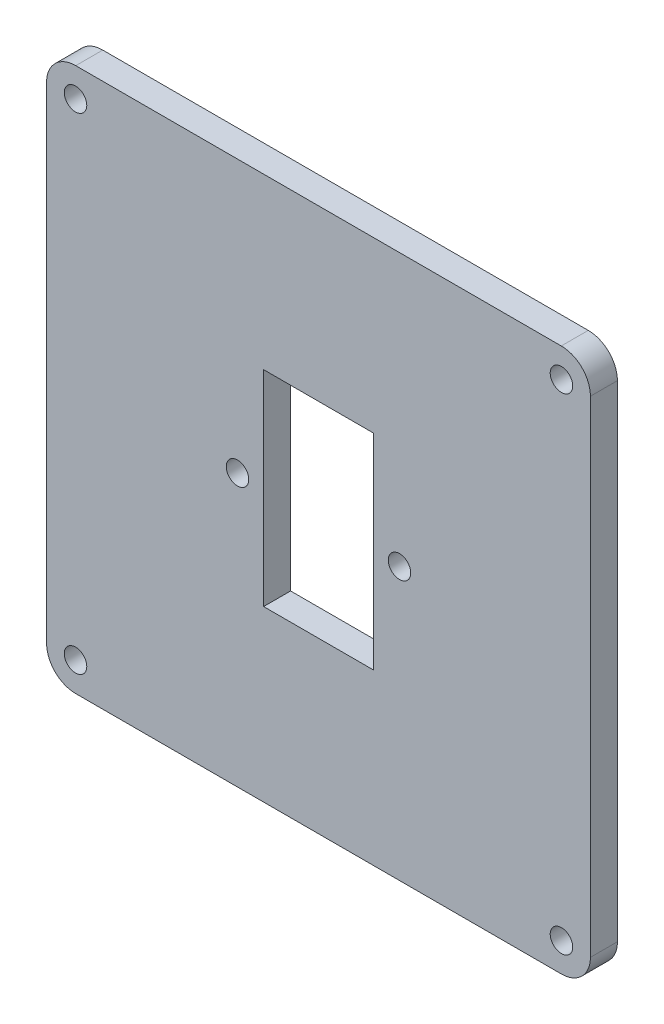
ISO-10303-21;
HEADER;
FILE_DESCRIPTION(('STEP AP214'),'2;1');
FILE_NAME('part.step','',(''),(''),'','','');
FILE_SCHEMA(('AUTOMOTIVE_DESIGN { 1 0 10303 214 1 1 1 1 }'));
ENDSEC;
DATA;
#1=APPLICATION_CONTEXT('core data for automotive mechanical design processes');
#2=APPLICATION_PROTOCOL_DEFINITION('international standard','automotive_design',2000,#1);
#3=PRODUCT_CONTEXT('',#1,'mechanical');
#4=PRODUCT('Part','Part','',(#3));
#5=PRODUCT_RELATED_PRODUCT_CATEGORY('part','',(#4));
#6=PRODUCT_DEFINITION_FORMATION('','',#4);
#7=PRODUCT_DEFINITION_CONTEXT('part definition',#1,'design');
#8=PRODUCT_DEFINITION('design','',#6,#7);
#9=PRODUCT_DEFINITION_SHAPE('','',#8);
#10=(LENGTH_UNIT() NAMED_UNIT(*) SI_UNIT(.MILLI.,.METRE.));
#11=(NAMED_UNIT(*) PLANE_ANGLE_UNIT() SI_UNIT($,.RADIAN.));
#12=(NAMED_UNIT(*) SI_UNIT($,.STERADIAN.) SOLID_ANGLE_UNIT());
#13=UNCERTAINTY_MEASURE_WITH_UNIT(LENGTH_MEASURE(1.E-05),#10,'distance_accuracy_value','');
#14=(GEOMETRIC_REPRESENTATION_CONTEXT(3) GLOBAL_UNCERTAINTY_ASSIGNED_CONTEXT((#13)) GLOBAL_UNIT_ASSIGNED_CONTEXT((#10,
#11,#12)) REPRESENTATION_CONTEXT('',''));
#15=CARTESIAN_POINT('',(0.,0.,0.));
#16=DIRECTION('',(0.,0.,1.));
#17=DIRECTION('',(1.,0.,0.));
#18=AXIS2_PLACEMENT_3D('',#15,#16,#17);
#19=CARTESIAN_POINT('',(228.017317101129,145.205782678348,3.));
#20=DIRECTION('',(0.,0.,1.));
#21=DIRECTION('',(1.,0.,0.));
#22=AXIS2_PLACEMENT_3D('',#19,#20,#21);
#23=PLANE('',#22);
#24=CARTESIAN_POINT('',(264.017321150929,118.206143662148,3.));
#25=DIRECTION('',(0.,0.,1.));
#26=DIRECTION('',(1.,0.,0.));
#27=AXIS2_PLACEMENT_3D('',#24,#25,#26);
#28=CIRCLE('',#27,1.25000000000002);
#29=CARTESIAN_POINT('',(265.267321150929,118.206143662148,3.));
#30=VERTEX_POINT('',#29);
#31=EDGE_CURVE('E327',#30,#30,#28,.T.);
#32=ORIENTED_EDGE('',*,*,#31,.F.);
#33=EDGE_LOOP('',(#32));
#34=FACE_BOUND('',#33,.T.);
#35=CARTESIAN_POINT('',(282.017317101129,145.205782678348,3.));
#36=DIRECTION('',(0.,0.,1.));
#37=DIRECTION('',(1.,0.,0.));
#38=AXIS2_PLACEMENT_3D('',#35,#36,#37);
#39=CIRCLE('',#38,1.24999999999996);
#40=CARTESIAN_POINT('',(283.267317101129,145.205782678348,3.));
#41=VERTEX_POINT('',#40);
#42=EDGE_CURVE('E339',#41,#41,#39,.T.);
#43=ORIENTED_EDGE('',*,*,#42,.F.);
#44=EDGE_LOOP('',(#43));
#45=FACE_BOUND('',#44,.T.);
#46=CARTESIAN_POINT('',(282.017317101129,91.2057826783484,3.));
#47=DIRECTION('',(0.,0.,1.));
#48=DIRECTION('',(1.,0.,0.));
#49=AXIS2_PLACEMENT_3D('',#46,#47,#48);
#50=CIRCLE('',#49,1.24999999999995);
#51=CARTESIAN_POINT('',(283.267317101129,91.2057826783484,3.));
#52=VERTEX_POINT('',#51);
#53=EDGE_CURVE('E151',#52,#52,#50,.T.);
#54=ORIENTED_EDGE('',*,*,#53,.F.);
#55=EDGE_LOOP('',(#54));
#56=FACE_BOUND('',#55,.T.);
#57=CARTESIAN_POINT('',(228.017317101129,145.205782678348,3.));
#58=DIRECTION('',(0.,0.,1.));
#59=DIRECTION('',(1.,0.,0.));
#60=AXIS2_PLACEMENT_3D('',#57,#58,#59);
#61=CIRCLE('',#60,3.21791545784593);
#62=CARTESIAN_POINT('',(228.04079572975,148.4236124824,3.));
#63=VERTEX_POINT('',#62);
#64=CARTESIAN_POINT('',(224.799401663531,145.206143662146,3.));
#65=VERTEX_POINT('',#64);
#66=EDGE_CURVE('E161',#63,#65,#61,.T.);
#67=ORIENTED_EDGE('',*,*,#66,.T.);
#68=DIRECTION('',(0.,-1.,0.));
#69=VECTOR('',#68,1.);
#70=CARTESIAN_POINT('',(224.799401663531,145.206143662146,3.));
#71=LINE('',#70,#69);
#72=CARTESIAN_POINT('',(224.799401663531,91.206143662146,3.));
#73=VERTEX_POINT('',#72);
#74=EDGE_CURVE('E164',#65,#73,#71,.T.);
#75=ORIENTED_EDGE('',*,*,#74,.T.);
#76=CARTESIAN_POINT('',(228.017317101129,91.2057826783484,3.));
#77=DIRECTION('',(0.,0.,1.));
#78=DIRECTION('',(1.,0.,0.));
#79=AXIS2_PLACEMENT_3D('',#76,#77,#78);
#80=CIRCLE('',#79,3.21791545784581);
#81=CARTESIAN_POINT('',(228.042648658479,87.9879669275564,3.));
#82=VERTEX_POINT('',#81);
#83=EDGE_CURVE('E167',#73,#82,#80,.T.);
#84=ORIENTED_EDGE('',*,*,#83,.T.);
#85=DIRECTION('',(1.,0.,0.));
#86=VECTOR('',#85,1.);
#87=CARTESIAN_POINT('',(228.042648658479,87.9879669275564,3.));
#88=LINE('',#87,#86);
#89=CARTESIAN_POINT('',(281.991993643367,87.9879669275563,3.));
#90=VERTEX_POINT('',#89);
#91=EDGE_CURVE('E169',#82,#90,#88,.T.);
#92=ORIENTED_EDGE('',*,*,#91,.T.);
#93=CARTESIAN_POINT('',(282.017317101129,91.2057826783484,3.));
#94=DIRECTION('',(0.,0.,1.));
#95=DIRECTION('',(1.,0.,0.));
#96=AXIS2_PLACEMENT_3D('',#93,#94,#95);
#97=CIRCLE('',#96,3.21791539409578);
#98=CARTESIAN_POINT('',(285.235232477242,91.2061228745628,3.));
#99=VERTEX_POINT('',#98);
#100=EDGE_CURVE('E171',#90,#99,#97,.T.);
#101=ORIENTED_EDGE('',*,*,#100,.T.);
#102=DIRECTION('',(0.,1.,0.));
#103=VECTOR('',#102,1.);
#104=CARTESIAN_POINT('',(285.235232477242,91.2061228745628,3.));
#105=LINE('',#104,#103);
#106=CARTESIAN_POINT('',(285.235232477242,145.20616444973,3.));
#107=VERTEX_POINT('',#106);
#108=EDGE_CURVE('E173',#99,#107,#105,.T.);
#109=ORIENTED_EDGE('',*,*,#108,.T.);
#110=CARTESIAN_POINT('',(282.017317101129,145.205782678348,3.));
#111=DIRECTION('',(0.,0.,1.));
#112=DIRECTION('',(1.,0.,0.));
#113=AXIS2_PLACEMENT_3D('',#110,#111,#112);
#114=CIRCLE('',#113,3.21791539875964);
#115=CARTESIAN_POINT('',(281.993846572094,148.4236124824,3.));
#116=VERTEX_POINT('',#115);
#117=EDGE_CURVE('E175',#107,#116,#114,.T.);
#118=ORIENTED_EDGE('',*,*,#117,.T.);
#119=DIRECTION('',(-1.,0.,0.));
#120=VECTOR('',#119,1.);
#121=CARTESIAN_POINT('',(228.04079572975,148.4236124824,3.));
#122=LINE('',#121,#120);
#123=EDGE_CURVE('E177',#116,#63,#122,.T.);
#124=ORIENTED_EDGE('',*,*,#123,.T.);
#125=EDGE_LOOP('',(#67,#75,#84,#92,#101,#109,#118,#124));
#126=FACE_BOUND('',#125,.T.);
#127=DIRECTION('',(1.,0.,0.));
#128=VECTOR('',#127,1.);
#129=CARTESIAN_POINT('',(248.917321150929,106.806143662148,3.));
#130=LINE('',#129,#128);
#131=CARTESIAN_POINT('',(248.917321150929,106.806143662148,3.));
#132=VERTEX_POINT('',#131);
#133=CARTESIAN_POINT('',(261.117321150929,106.806143662148,3.));
#134=VERTEX_POINT('',#133);
#135=EDGE_CURVE('E130',#132,#134,#130,.T.);
#136=ORIENTED_EDGE('',*,*,#135,.F.);
#137=DIRECTION('',(0.,-1.,0.));
#138=VECTOR('',#137,1.);
#139=CARTESIAN_POINT('',(248.917321150929,129.606143662148,3.));
#140=LINE('',#139,#138);
#141=CARTESIAN_POINT('',(248.917321150929,129.606143662148,3.));
#142=VERTEX_POINT('',#141);
#143=EDGE_CURVE('E122',#142,#132,#140,.T.);
#144=ORIENTED_EDGE('',*,*,#143,.F.);
#145=DIRECTION('',(-1.,0.,0.));
#146=VECTOR('',#145,1.);
#147=CARTESIAN_POINT('',(261.117321150929,129.606143662148,3.));
#148=LINE('',#147,#146);
#149=CARTESIAN_POINT('',(261.117321150929,129.606143662148,3.));
#150=VERTEX_POINT('',#149);
#151=EDGE_CURVE('E145',#150,#142,#148,.T.);
#152=ORIENTED_EDGE('',*,*,#151,.F.);
#153=DIRECTION('',(0.,1.,0.));
#154=VECTOR('',#153,1.);
#155=CARTESIAN_POINT('',(261.117321150929,106.806143662148,3.));
#156=LINE('',#155,#154);
#157=EDGE_CURVE('E143',#134,#150,#156,.T.);
#158=ORIENTED_EDGE('',*,*,#157,.F.);
#159=EDGE_LOOP('',(#136,#144,#152,#158));
#160=FACE_BOUND('',#159,.T.);
#161=CARTESIAN_POINT('',(228.017317101129,91.2057826783484,3.));
#162=DIRECTION('',(0.,0.,1.));
#163=DIRECTION('',(1.,0.,0.));
#164=AXIS2_PLACEMENT_3D('',#161,#162,#163);
#165=CIRCLE('',#164,1.25000000000001);
#166=CARTESIAN_POINT('',(229.267317101129,91.2057826783484,3.));
#167=VERTEX_POINT('',#166);
#168=EDGE_CURVE('E345',#167,#167,#165,.T.);
#169=ORIENTED_EDGE('',*,*,#168,.F.);
#170=EDGE_LOOP('',(#169));
#171=FACE_BOUND('',#170,.T.);
#172=CARTESIAN_POINT('',(246.017321150929,118.206143662148,3.));
#173=DIRECTION('',(0.,0.,1.));
#174=DIRECTION('',(1.,0.,0.));
#175=AXIS2_PLACEMENT_3D('',#172,#173,#174);
#176=CIRCLE('',#175,1.25000000000001);
#177=CARTESIAN_POINT('',(247.267321150929,118.206143662148,3.));
#178=VERTEX_POINT('',#177);
#179=EDGE_CURVE('E333',#178,#178,#176,.T.);
#180=ORIENTED_EDGE('',*,*,#179,.F.);
#181=EDGE_LOOP('',(#180));
#182=FACE_BOUND('',#181,.T.);
#183=CARTESIAN_POINT('',(228.017317101129,145.205782678348,3.));
#184=DIRECTION('',(0.,0.,1.));
#185=DIRECTION('',(1.,0.,0.));
#186=AXIS2_PLACEMENT_3D('',#183,#184,#185);
#187=CIRCLE('',#186,1.25000000000001);
#188=CARTESIAN_POINT('',(229.267317101129,145.205782678348,3.));
#189=VERTEX_POINT('',#188);
#190=EDGE_CURVE('E318',#189,#189,#187,.T.);
#191=ORIENTED_EDGE('',*,*,#190,.F.);
#192=EDGE_LOOP('',(#191));
#193=FACE_BOUND('',#192,.T.);
#194=ADVANCED_FACE('F33',(#34,#45,#56,#126,#160,#171,#182,#193),#23,.T.);
#195=CARTESIAN_POINT('',(228.017317101129,145.205782678348,0.));
#196=DIRECTION('',(0.,0.,1.));
#197=DIRECTION('',(1.,0.,0.));
#198=AXIS2_PLACEMENT_3D('',#195,#196,#197);
#199=PLANE('',#198);
#200=CARTESIAN_POINT('',(228.017317101129,145.205782678348,0.));
#201=DIRECTION('',(0.,0.,1.));
#202=DIRECTION('',(1.,0.,0.));
#203=AXIS2_PLACEMENT_3D('',#200,#201,#202);
#204=CIRCLE('',#203,3.21791545784593);
#205=CARTESIAN_POINT('',(228.04079572975,148.4236124824,0.));
#206=VERTEX_POINT('',#205);
#207=CARTESIAN_POINT('',(224.799401663531,145.206143662146,0.));
#208=VERTEX_POINT('',#207);
#209=EDGE_CURVE('E138',#206,#208,#204,.T.);
#210=ORIENTED_EDGE('',*,*,#209,.F.);
#211=DIRECTION('',(-1.,0.,0.));
#212=VECTOR('',#211,1.);
#213=CARTESIAN_POINT('',(228.04079572975,148.4236124824,0.));
#214=LINE('',#213,#212);
#215=CARTESIAN_POINT('',(281.993846572094,148.4236124824,0.));
#216=VERTEX_POINT('',#215);
#217=EDGE_CURVE('E165',#216,#206,#214,.T.);
#218=ORIENTED_EDGE('',*,*,#217,.F.);
#219=CARTESIAN_POINT('',(282.017317101129,145.205782678348,0.));
#220=DIRECTION('',(0.,0.,1.));
#221=DIRECTION('',(1.,0.,0.));
#222=AXIS2_PLACEMENT_3D('',#219,#220,#221);
#223=CIRCLE('',#222,3.21791539875964);
#224=CARTESIAN_POINT('',(285.235232477242,145.20616444973,0.));
#225=VERTEX_POINT('',#224);
#226=EDGE_CURVE('E192',#225,#216,#223,.T.);
#227=ORIENTED_EDGE('',*,*,#226,.F.);
#228=DIRECTION('',(0.,1.,0.));
#229=VECTOR('',#228,1.);
#230=CARTESIAN_POINT('',(285.235232477242,91.2061228745628,0.));
#231=LINE('',#230,#229);
#232=CARTESIAN_POINT('',(285.235232477242,91.2061228745628,0.));
#233=VERTEX_POINT('',#232);
#234=EDGE_CURVE('E190',#233,#225,#231,.T.);
#235=ORIENTED_EDGE('',*,*,#234,.F.);
#236=CARTESIAN_POINT('',(282.017317101129,91.2057826783484,0.));
#237=DIRECTION('',(0.,0.,1.));
#238=DIRECTION('',(1.,0.,0.));
#239=AXIS2_PLACEMENT_3D('',#236,#237,#238);
#240=CIRCLE('',#239,3.21791539409578);
#241=CARTESIAN_POINT('',(281.991993643367,87.9879669275563,0.));
#242=VERTEX_POINT('',#241);
#243=EDGE_CURVE('E188',#242,#233,#240,.T.);
#244=ORIENTED_EDGE('',*,*,#243,.F.);
#245=DIRECTION('',(1.,0.,0.));
#246=VECTOR('',#245,1.);
#247=CARTESIAN_POINT('',(228.042648658479,87.9879669275564,0.));
#248=LINE('',#247,#246);
#249=CARTESIAN_POINT('',(228.042648658479,87.9879669275564,0.));
#250=VERTEX_POINT('',#249);
#251=EDGE_CURVE('E186',#250,#242,#248,.T.);
#252=ORIENTED_EDGE('',*,*,#251,.F.);
#253=CARTESIAN_POINT('',(228.017317101129,91.2057826783484,0.));
#254=DIRECTION('',(0.,0.,1.));
#255=DIRECTION('',(1.,0.,0.));
#256=AXIS2_PLACEMENT_3D('',#253,#254,#255);
#257=CIRCLE('',#256,3.21791545784581);
#258=CARTESIAN_POINT('',(224.799401663531,91.206143662146,0.));
#259=VERTEX_POINT('',#258);
#260=EDGE_CURVE('E184',#259,#250,#257,.T.);
#261=ORIENTED_EDGE('',*,*,#260,.F.);
#262=DIRECTION('',(0.,-1.,0.));
#263=VECTOR('',#262,1.);
#264=CARTESIAN_POINT('',(224.799401663531,145.206143662146,0.));
#265=LINE('',#264,#263);
#266=EDGE_CURVE('E182',#208,#259,#265,.T.);
#267=ORIENTED_EDGE('',*,*,#266,.F.);
#268=EDGE_LOOP('',(#210,#218,#227,#235,#244,#252,#261,#267));
#269=FACE_BOUND('',#268,.T.);
#270=DIRECTION('',(0.,-1.,0.));
#271=VECTOR('',#270,1.);
#272=CARTESIAN_POINT('',(248.917321150929,129.606143662148,0.));
#273=LINE('',#272,#271);
#274=CARTESIAN_POINT('',(248.917321150929,129.606143662148,0.));
#275=VERTEX_POINT('',#274);
#276=CARTESIAN_POINT('',(248.917321150929,106.806143662148,0.));
#277=VERTEX_POINT('',#276);
#278=EDGE_CURVE('E56',#275,#277,#273,.T.);
#279=ORIENTED_EDGE('',*,*,#278,.T.);
#280=DIRECTION('',(1.,0.,0.));
#281=VECTOR('',#280,1.);
#282=CARTESIAN_POINT('',(248.917321150929,106.806143662148,0.));
#283=LINE('',#282,#281);
#284=CARTESIAN_POINT('',(261.117321150929,106.806143662148,0.));
#285=VERTEX_POINT('',#284);
#286=EDGE_CURVE('E137',#277,#285,#283,.T.);
#287=ORIENTED_EDGE('',*,*,#286,.T.);
#288=DIRECTION('',(0.,1.,0.));
#289=VECTOR('',#288,1.);
#290=CARTESIAN_POINT('',(261.117321150929,106.806143662148,0.));
#291=LINE('',#290,#289);
#292=CARTESIAN_POINT('',(261.117321150929,129.606143662148,0.));
#293=VERTEX_POINT('',#292);
#294=EDGE_CURVE('E153',#285,#293,#291,.T.);
#295=ORIENTED_EDGE('',*,*,#294,.T.);
#296=DIRECTION('',(-1.,0.,0.));
#297=VECTOR('',#296,1.);
#298=CARTESIAN_POINT('',(261.117321150929,129.606143662148,0.));
#299=LINE('',#298,#297);
#300=EDGE_CURVE('E131',#293,#275,#299,.T.);
#301=ORIENTED_EDGE('',*,*,#300,.T.);
#302=EDGE_LOOP('',(#279,#287,#295,#301));
#303=FACE_BOUND('',#302,.T.);
#304=CARTESIAN_POINT('',(282.017317101129,91.2057826783484,0.));
#305=DIRECTION('',(0.,0.,1.));
#306=DIRECTION('',(1.,0.,0.));
#307=AXIS2_PLACEMENT_3D('',#304,#305,#306);
#308=CIRCLE('',#307,1.24999999999995);
#309=CARTESIAN_POINT('',(283.267317101129,91.2057826783484,0.));
#310=VERTEX_POINT('',#309);
#311=EDGE_CURVE('E348',#310,#310,#308,.T.);
#312=ORIENTED_EDGE('',*,*,#311,.T.);
#313=EDGE_LOOP('',(#312));
#314=FACE_BOUND('',#313,.T.);
#315=CARTESIAN_POINT('',(228.017317101129,91.2057826783484,0.));
#316=DIRECTION('',(0.,0.,1.));
#317=DIRECTION('',(1.,0.,0.));
#318=AXIS2_PLACEMENT_3D('',#315,#316,#317);
#319=CIRCLE('',#318,1.25000000000001);
#320=CARTESIAN_POINT('',(229.267317101129,91.2057826783484,0.));
#321=VERTEX_POINT('',#320);
#322=EDGE_CURVE('E342',#321,#321,#319,.T.);
#323=ORIENTED_EDGE('',*,*,#322,.T.);
#324=EDGE_LOOP('',(#323));
#325=FACE_BOUND('',#324,.T.);
#326=CARTESIAN_POINT('',(282.017317101129,145.205782678348,0.));
#327=DIRECTION('',(0.,0.,1.));
#328=DIRECTION('',(1.,0.,0.));
#329=AXIS2_PLACEMENT_3D('',#326,#327,#328);
#330=CIRCLE('',#329,1.24999999999996);
#331=CARTESIAN_POINT('',(283.267317101129,145.205782678348,0.));
#332=VERTEX_POINT('',#331);
#333=EDGE_CURVE('E336',#332,#332,#330,.T.);
#334=ORIENTED_EDGE('',*,*,#333,.T.);
#335=EDGE_LOOP('',(#334));
#336=FACE_BOUND('',#335,.T.);
#337=CARTESIAN_POINT('',(246.017321150929,118.206143662148,0.));
#338=DIRECTION('',(0.,0.,1.));
#339=DIRECTION('',(1.,0.,0.));
#340=AXIS2_PLACEMENT_3D('',#337,#338,#339);
#341=CIRCLE('',#340,1.25000000000001);
#342=CARTESIAN_POINT('',(247.267321150929,118.206143662148,0.));
#343=VERTEX_POINT('',#342);
#344=EDGE_CURVE('E330',#343,#343,#341,.T.);
#345=ORIENTED_EDGE('',*,*,#344,.T.);
#346=EDGE_LOOP('',(#345));
#347=FACE_BOUND('',#346,.T.);
#348=CARTESIAN_POINT('',(264.017321150929,118.206143662148,0.));
#349=DIRECTION('',(0.,0.,1.));
#350=DIRECTION('',(1.,0.,0.));
#351=AXIS2_PLACEMENT_3D('',#348,#349,#350);
#352=CIRCLE('',#351,1.25000000000002);
#353=CARTESIAN_POINT('',(265.267321150929,118.206143662148,0.));
#354=VERTEX_POINT('',#353);
#355=EDGE_CURVE('E324',#354,#354,#352,.T.);
#356=ORIENTED_EDGE('',*,*,#355,.T.);
#357=EDGE_LOOP('',(#356));
#358=FACE_BOUND('',#357,.T.);
#359=CARTESIAN_POINT('',(228.017317101129,145.205782678348,0.));
#360=DIRECTION('',(0.,0.,1.));
#361=DIRECTION('',(1.,0.,0.));
#362=AXIS2_PLACEMENT_3D('',#359,#360,#361);
#363=CIRCLE('',#362,1.25000000000001);
#364=CARTESIAN_POINT('',(229.267317101129,145.205782678348,0.));
#365=VERTEX_POINT('',#364);
#366=EDGE_CURVE('E321',#365,#365,#363,.T.);
#367=ORIENTED_EDGE('',*,*,#366,.T.);
#368=EDGE_LOOP('',(#367));
#369=FACE_BOUND('',#368,.T.);
#370=ADVANCED_FACE('F222',(#269,#303,#314,#325,#336,#347,#358,#369),#199,.F.);
#371=CARTESIAN_POINT('',(228.017317101129,145.205782678348,3.));
#372=DIRECTION('',(0.,0.,-1.));
#373=DIRECTION('',(-1.,0.,0.));
#374=AXIS2_PLACEMENT_3D('',#371,#372,#373);
#375=CYLINDRICAL_SURFACE('',#374,3.21791545784593);
#376=ORIENTED_EDGE('',*,*,#209,.T.);
#377=DIRECTION('',(0.,0.,-1.));
#378=VECTOR('',#377,1.);
#379=CARTESIAN_POINT('',(224.799401663531,145.206143662146,3.));
#380=LINE('',#379,#378);
#381=EDGE_CURVE('E11',#65,#208,#380,.T.);
#382=ORIENTED_EDGE('',*,*,#381,.F.);
#383=ORIENTED_EDGE('',*,*,#66,.F.);
#384=DIRECTION('',(0.,0.,-1.));
#385=VECTOR('',#384,1.);
#386=CARTESIAN_POINT('',(228.04079572975,148.4236124824,3.));
#387=LINE('',#386,#385);
#388=EDGE_CURVE('E179',#63,#206,#387,.T.);
#389=ORIENTED_EDGE('',*,*,#388,.T.);
#390=EDGE_LOOP('',(#376,#382,#383,#389));
#391=FACE_BOUND('',#390,.T.);
#392=ADVANCED_FACE('F35',(#391),#375,.T.);
#393=CARTESIAN_POINT('',(224.799401663531,145.206143662146,3.));
#394=DIRECTION('',(1.,0.,0.));
#395=DIRECTION('',(0.,1.,0.));
#396=AXIS2_PLACEMENT_3D('',#393,#394,#395);
#397=PLANE('',#396);
#398=ORIENTED_EDGE('',*,*,#266,.T.);
#399=DIRECTION('',(0.,0.,-1.));
#400=VECTOR('',#399,1.);
#401=CARTESIAN_POINT('',(224.799401663531,91.206143662146,3.));
#402=LINE('',#401,#400);
#403=EDGE_CURVE('E41',#73,#259,#402,.T.);
#404=ORIENTED_EDGE('',*,*,#403,.F.);
#405=ORIENTED_EDGE('',*,*,#74,.F.);
#406=ORIENTED_EDGE('',*,*,#381,.T.);
#407=EDGE_LOOP('',(#398,#404,#405,#406));
#408=FACE_BOUND('',#407,.T.);
#409=ADVANCED_FACE('F239',(#408),#397,.F.);
#410=CARTESIAN_POINT('',(228.017317101129,91.2057826783484,3.));
#411=DIRECTION('',(0.,0.,-1.));
#412=DIRECTION('',(-1.,0.,0.));
#413=AXIS2_PLACEMENT_3D('',#410,#411,#412);
#414=CYLINDRICAL_SURFACE('',#413,3.21791545784581);
#415=ORIENTED_EDGE('',*,*,#260,.T.);
#416=DIRECTION('',(0.,0.,-1.));
#417=VECTOR('',#416,1.);
#418=CARTESIAN_POINT('',(228.042648658479,87.9879669275564,3.));
#419=LINE('',#418,#417);
#420=EDGE_CURVE('E209',#82,#250,#419,.T.);
#421=ORIENTED_EDGE('',*,*,#420,.F.);
#422=ORIENTED_EDGE('',*,*,#83,.F.);
#423=ORIENTED_EDGE('',*,*,#403,.T.);
#424=EDGE_LOOP('',(#415,#421,#422,#423));
#425=FACE_BOUND('',#424,.T.);
#426=ADVANCED_FACE('F216',(#425),#414,.T.);
#427=CARTESIAN_POINT('',(228.042648658479,87.9879669275564,3.));
#428=DIRECTION('',(0.,1.,0.));
#429=DIRECTION('',(-1.,0.,0.));
#430=AXIS2_PLACEMENT_3D('',#427,#428,#429);
#431=PLANE('',#430);
#432=ORIENTED_EDGE('',*,*,#251,.T.);
#433=DIRECTION('',(0.,0.,-1.));
#434=VECTOR('',#433,1.);
#435=CARTESIAN_POINT('',(281.991993643367,87.9879669275563,3.));
#436=LINE('',#435,#434);
#437=EDGE_CURVE('E206',#90,#242,#436,.T.);
#438=ORIENTED_EDGE('',*,*,#437,.F.);
#439=ORIENTED_EDGE('',*,*,#91,.F.);
#440=ORIENTED_EDGE('',*,*,#420,.T.);
#441=EDGE_LOOP('',(#432,#438,#439,#440));
#442=FACE_BOUND('',#441,.T.);
#443=ADVANCED_FACE('F228',(#442),#431,.F.);
#444=CARTESIAN_POINT('',(282.017317101129,91.2057826783484,3.));
#445=DIRECTION('',(0.,0.,-1.));
#446=DIRECTION('',(-1.,0.,0.));
#447=AXIS2_PLACEMENT_3D('',#444,#445,#446);
#448=CYLINDRICAL_SURFACE('',#447,3.21791539409578);
#449=ORIENTED_EDGE('',*,*,#243,.T.);
#450=DIRECTION('',(0.,0.,-1.));
#451=VECTOR('',#450,1.);
#452=CARTESIAN_POINT('',(285.235232477242,91.2061228745628,3.));
#453=LINE('',#452,#451);
#454=EDGE_CURVE('E203',#99,#233,#453,.T.);
#455=ORIENTED_EDGE('',*,*,#454,.F.);
#456=ORIENTED_EDGE('',*,*,#100,.F.);
#457=ORIENTED_EDGE('',*,*,#437,.T.);
#458=EDGE_LOOP('',(#449,#455,#456,#457));
#459=FACE_BOUND('',#458,.T.);
#460=ADVANCED_FACE('F232',(#459),#448,.T.);
#461=CARTESIAN_POINT('',(285.235232477242,91.2061228745628,3.));
#462=DIRECTION('',(-1.,0.,0.));
#463=DIRECTION('',(0.,0.,1.));
#464=AXIS2_PLACEMENT_3D('',#461,#462,#463);
#465=PLANE('',#464);
#466=ORIENTED_EDGE('',*,*,#234,.T.);
#467=DIRECTION('',(0.,0.,-1.));
#468=VECTOR('',#467,1.);
#469=CARTESIAN_POINT('',(285.235232477242,145.20616444973,3.));
#470=LINE('',#469,#468);
#471=EDGE_CURVE('E200',#107,#225,#470,.T.);
#472=ORIENTED_EDGE('',*,*,#471,.F.);
#473=ORIENTED_EDGE('',*,*,#108,.F.);
#474=ORIENTED_EDGE('',*,*,#454,.T.);
#475=EDGE_LOOP('',(#466,#472,#473,#474));
#476=FACE_BOUND('',#475,.T.);
#477=ADVANCED_FACE('F252',(#476),#465,.F.);
#478=CARTESIAN_POINT('',(282.017317101129,145.205782678348,3.));
#479=DIRECTION('',(0.,0.,-1.));
#480=DIRECTION('',(-1.,0.,0.));
#481=AXIS2_PLACEMENT_3D('',#478,#479,#480);
#482=CYLINDRICAL_SURFACE('',#481,3.21791539875964);
#483=ORIENTED_EDGE('',*,*,#226,.T.);
#484=DIRECTION('',(0.,0.,-1.));
#485=VECTOR('',#484,1.);
#486=CARTESIAN_POINT('',(281.993846572094,148.4236124824,3.));
#487=LINE('',#486,#485);
#488=EDGE_CURVE('E197',#116,#216,#487,.T.);
#489=ORIENTED_EDGE('',*,*,#488,.F.);
#490=ORIENTED_EDGE('',*,*,#117,.F.);
#491=ORIENTED_EDGE('',*,*,#471,.T.);
#492=EDGE_LOOP('',(#483,#489,#490,#491));
#493=FACE_BOUND('',#492,.T.);
#494=ADVANCED_FACE('F250',(#493),#482,.T.);
#495=CARTESIAN_POINT('',(228.04079572975,148.4236124824,3.));
#496=DIRECTION('',(0.,-1.,0.));
#497=DIRECTION('',(1.,0.,0.));
#498=AXIS2_PLACEMENT_3D('',#495,#496,#497);
#499=PLANE('',#498);
#500=ORIENTED_EDGE('',*,*,#217,.T.);
#501=ORIENTED_EDGE('',*,*,#388,.F.);
#502=ORIENTED_EDGE('',*,*,#123,.F.);
#503=ORIENTED_EDGE('',*,*,#488,.T.);
#504=EDGE_LOOP('',(#500,#501,#502,#503));
#505=FACE_BOUND('',#504,.T.);
#506=ADVANCED_FACE('F245',(#505),#499,.F.);
#507=CARTESIAN_POINT('',(248.917321150929,129.606143662148,3.));
#508=DIRECTION('',(1.,0.,0.));
#509=DIRECTION('',(0.,0.,-1.));
#510=AXIS2_PLACEMENT_3D('',#507,#508,#509);
#511=PLANE('',#510);
#512=ORIENTED_EDGE('',*,*,#278,.F.);
#513=DIRECTION('',(0.,0.,-1.));
#514=VECTOR('',#513,1.);
#515=CARTESIAN_POINT('',(248.917321150929,129.606143662148,3.));
#516=LINE('',#515,#514);
#517=EDGE_CURVE('E126',#142,#275,#516,.T.);
#518=ORIENTED_EDGE('',*,*,#517,.F.);
#519=ORIENTED_EDGE('',*,*,#143,.T.);
#520=DIRECTION('',(0.,0.,-1.));
#521=VECTOR('',#520,1.);
#522=CARTESIAN_POINT('',(248.917321150929,106.806143662148,3.));
#523=LINE('',#522,#521);
#524=EDGE_CURVE('E125',#132,#277,#523,.T.);
#525=ORIENTED_EDGE('',*,*,#524,.T.);
#526=EDGE_LOOP('',(#512,#518,#519,#525));
#527=FACE_BOUND('',#526,.T.);
#528=ADVANCED_FACE('F124',(#527),#511,.T.);
#529=CARTESIAN_POINT('',(248.917321150929,106.806143662148,3.));
#530=DIRECTION('',(0.,1.,0.));
#531=DIRECTION('',(0.,0.,1.));
#532=AXIS2_PLACEMENT_3D('',#529,#530,#531);
#533=PLANE('',#532);
#534=ORIENTED_EDGE('',*,*,#286,.F.);
#535=ORIENTED_EDGE('',*,*,#524,.F.);
#536=ORIENTED_EDGE('',*,*,#135,.T.);
#537=DIRECTION('',(0.,0.,-1.));
#538=VECTOR('',#537,1.);
#539=CARTESIAN_POINT('',(261.117321150929,106.806143662148,3.));
#540=LINE('',#539,#538);
#541=EDGE_CURVE('E139',#134,#285,#540,.T.);
#542=ORIENTED_EDGE('',*,*,#541,.T.);
#543=EDGE_LOOP('',(#534,#535,#536,#542));
#544=FACE_BOUND('',#543,.T.);
#545=ADVANCED_FACE('F134',(#544),#533,.T.);
#546=CARTESIAN_POINT('',(261.117321150929,106.806143662148,3.));
#547=DIRECTION('',(-1.,0.,0.));
#548=DIRECTION('',(0.,0.,1.));
#549=AXIS2_PLACEMENT_3D('',#546,#547,#548);
#550=PLANE('',#549);
#551=ORIENTED_EDGE('',*,*,#294,.F.);
#552=ORIENTED_EDGE('',*,*,#541,.F.);
#553=ORIENTED_EDGE('',*,*,#157,.T.);
#554=DIRECTION('',(0.,0.,-1.));
#555=VECTOR('',#554,1.);
#556=CARTESIAN_POINT('',(261.117321150929,129.606143662148,3.));
#557=LINE('',#556,#555);
#558=EDGE_CURVE('E48',#150,#293,#557,.T.);
#559=ORIENTED_EDGE('',*,*,#558,.T.);
#560=EDGE_LOOP('',(#551,#552,#553,#559));
#561=FACE_BOUND('',#560,.T.);
#562=ADVANCED_FACE('F280',(#561),#550,.T.);
#563=CARTESIAN_POINT('',(261.117321150929,129.606143662148,3.));
#564=DIRECTION('',(0.,-1.,0.));
#565=DIRECTION('',(0.,0.,-1.));
#566=AXIS2_PLACEMENT_3D('',#563,#564,#565);
#567=PLANE('',#566);
#568=ORIENTED_EDGE('',*,*,#300,.F.);
#569=ORIENTED_EDGE('',*,*,#558,.F.);
#570=ORIENTED_EDGE('',*,*,#151,.T.);
#571=ORIENTED_EDGE('',*,*,#517,.T.);
#572=EDGE_LOOP('',(#568,#569,#570,#571));
#573=FACE_BOUND('',#572,.T.);
#574=ADVANCED_FACE('F284',(#573),#567,.T.);
#575=CARTESIAN_POINT('',(282.017317101129,91.2057826783484,3.));
#576=DIRECTION('',(0.,0.,-1.));
#577=DIRECTION('',(-1.,0.,0.));
#578=AXIS2_PLACEMENT_3D('',#575,#576,#577);
#579=CYLINDRICAL_SURFACE('',#578,1.24999999999995);
#580=ORIENTED_EDGE('',*,*,#53,.T.);
#581=EDGE_LOOP('',(#580));
#582=FACE_BOUND('',#581,.T.);
#583=ORIENTED_EDGE('',*,*,#311,.F.);
#584=EDGE_LOOP('',(#583));
#585=FACE_BOUND('',#584,.T.);
#586=ADVANCED_FACE('F290',(#582,#585),#579,.F.);
#587=CARTESIAN_POINT('',(228.017317101129,91.2057826783484,3.));
#588=DIRECTION('',(0.,0.,-1.));
#589=DIRECTION('',(-1.,0.,0.));
#590=AXIS2_PLACEMENT_3D('',#587,#588,#589);
#591=CYLINDRICAL_SURFACE('',#590,1.25000000000001);
#592=ORIENTED_EDGE('',*,*,#168,.T.);
#593=EDGE_LOOP('',(#592));
#594=FACE_BOUND('',#593,.T.);
#595=ORIENTED_EDGE('',*,*,#322,.F.);
#596=EDGE_LOOP('',(#595));
#597=FACE_BOUND('',#596,.T.);
#598=ADVANCED_FACE('F293',(#594,#597),#591,.F.);
#599=CARTESIAN_POINT('',(282.017317101129,145.205782678348,3.));
#600=DIRECTION('',(0.,0.,-1.));
#601=DIRECTION('',(-1.,0.,0.));
#602=AXIS2_PLACEMENT_3D('',#599,#600,#601);
#603=CYLINDRICAL_SURFACE('',#602,1.24999999999996);
#604=ORIENTED_EDGE('',*,*,#42,.T.);
#605=EDGE_LOOP('',(#604));
#606=FACE_BOUND('',#605,.T.);
#607=ORIENTED_EDGE('',*,*,#333,.F.);
#608=EDGE_LOOP('',(#607));
#609=FACE_BOUND('',#608,.T.);
#610=ADVANCED_FACE('F297',(#606,#609),#603,.F.);
#611=CARTESIAN_POINT('',(246.017321150929,118.206143662148,3.));
#612=DIRECTION('',(0.,0.,-1.));
#613=DIRECTION('',(-1.,0.,0.));
#614=AXIS2_PLACEMENT_3D('',#611,#612,#613);
#615=CYLINDRICAL_SURFACE('',#614,1.25000000000001);
#616=ORIENTED_EDGE('',*,*,#179,.T.);
#617=EDGE_LOOP('',(#616));
#618=FACE_BOUND('',#617,.T.);
#619=ORIENTED_EDGE('',*,*,#344,.F.);
#620=EDGE_LOOP('',(#619));
#621=FACE_BOUND('',#620,.T.);
#622=ADVANCED_FACE('F301',(#618,#621),#615,.F.);
#623=CARTESIAN_POINT('',(264.017321150929,118.206143662148,3.));
#624=DIRECTION('',(0.,0.,-1.));
#625=DIRECTION('',(-1.,0.,0.));
#626=AXIS2_PLACEMENT_3D('',#623,#624,#625);
#627=CYLINDRICAL_SURFACE('',#626,1.25000000000002);
#628=ORIENTED_EDGE('',*,*,#31,.T.);
#629=EDGE_LOOP('',(#628));
#630=FACE_BOUND('',#629,.T.);
#631=ORIENTED_EDGE('',*,*,#355,.F.);
#632=EDGE_LOOP('',(#631));
#633=FACE_BOUND('',#632,.T.);
#634=ADVANCED_FACE('F305',(#630,#633),#627,.F.);
#635=CARTESIAN_POINT('',(228.017317101129,145.205782678348,3.));
#636=DIRECTION('',(0.,0.,-1.));
#637=DIRECTION('',(-1.,0.,0.));
#638=AXIS2_PLACEMENT_3D('',#635,#636,#637);
#639=CYLINDRICAL_SURFACE('',#638,1.25000000000001);
#640=ORIENTED_EDGE('',*,*,#190,.T.);
#641=EDGE_LOOP('',(#640));
#642=FACE_BOUND('',#641,.T.);
#643=ORIENTED_EDGE('',*,*,#366,.F.);
#644=EDGE_LOOP('',(#643));
#645=FACE_BOUND('',#644,.T.);
#646=ADVANCED_FACE('F309',(#642,#645),#639,.F.);
#647=CLOSED_SHELL('',(#194,#370,#392,#409,#426,#443,#460,#477,#494,#506,#528,#545,#562,#574,
#586,#598,#610,#622,#634,#646));
#648=MANIFOLD_SOLID_BREP('B2',#647);
#649=ADVANCED_BREP_SHAPE_REPRESENTATION('',(#18,#648),#14);
#650=SHAPE_DEFINITION_REPRESENTATION(#9,#649);
ENDSEC;
END-ISO-10303-21;
